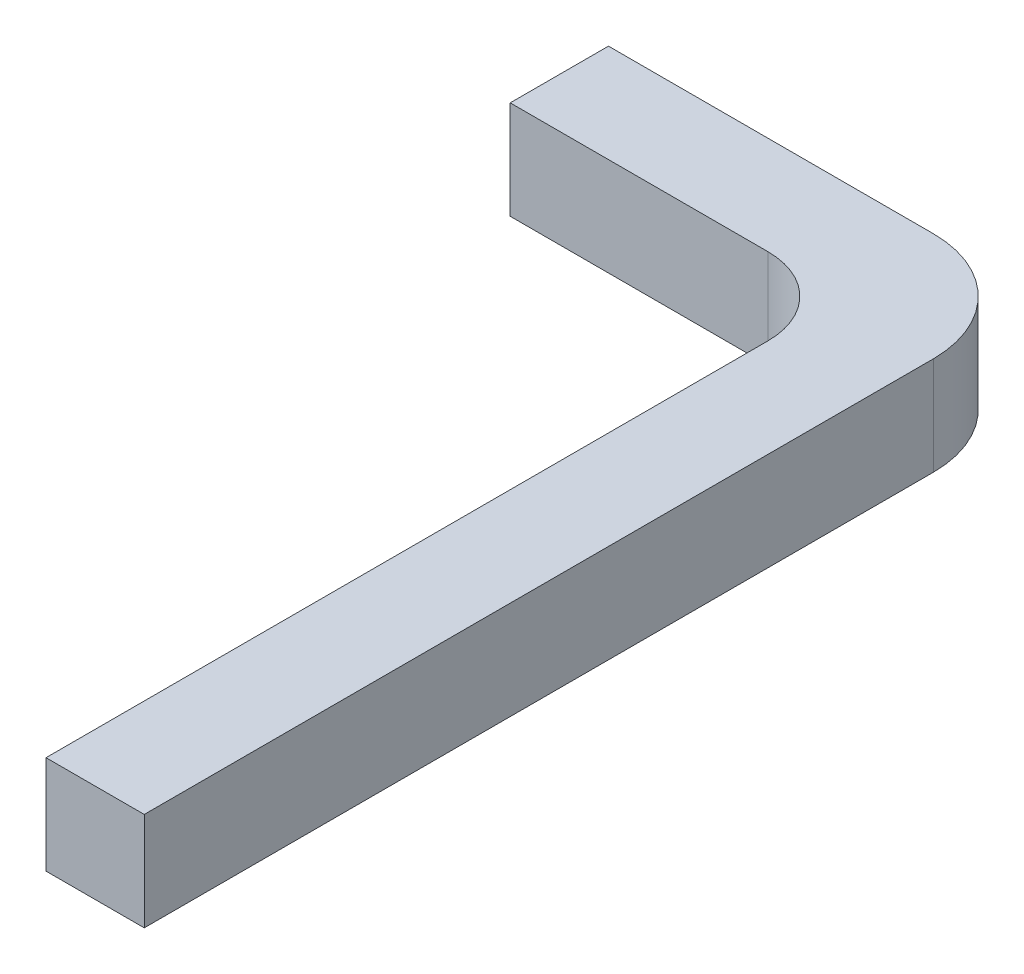
ISO-10303-21;
HEADER;
FILE_DESCRIPTION(('STEP AP214'),'2;1');
FILE_NAME('part.step','',(''),(''),'','','');
FILE_SCHEMA(('AUTOMOTIVE_DESIGN { 1 0 10303 214 1 1 1 1 }'));
ENDSEC;
DATA;
#1=APPLICATION_CONTEXT('core data for automotive mechanical design processes');
#2=APPLICATION_PROTOCOL_DEFINITION('international standard','automotive_design',2000,#1);
#3=PRODUCT_CONTEXT('',#1,'mechanical');
#4=PRODUCT('Part','Part','',(#3));
#5=PRODUCT_RELATED_PRODUCT_CATEGORY('part','',(#4));
#6=PRODUCT_DEFINITION_FORMATION('','',#4);
#7=PRODUCT_DEFINITION_CONTEXT('part definition',#1,'design');
#8=PRODUCT_DEFINITION('design','',#6,#7);
#9=PRODUCT_DEFINITION_SHAPE('','',#8);
#10=(LENGTH_UNIT() NAMED_UNIT(*) SI_UNIT(.MILLI.,.METRE.));
#11=(NAMED_UNIT(*) PLANE_ANGLE_UNIT() SI_UNIT($,.RADIAN.));
#12=(NAMED_UNIT(*) SI_UNIT($,.STERADIAN.) SOLID_ANGLE_UNIT());
#13=UNCERTAINTY_MEASURE_WITH_UNIT(LENGTH_MEASURE(1.E-05),#10,'distance_accuracy_value','');
#14=(GEOMETRIC_REPRESENTATION_CONTEXT(3) GLOBAL_UNCERTAINTY_ASSIGNED_CONTEXT((#13)) GLOBAL_UNIT_ASSIGNED_CONTEXT((#10,
#11,#12)) REPRESENTATION_CONTEXT('',''));
#15=CARTESIAN_POINT('',(0.,0.,0.));
#16=DIRECTION('',(0.,0.,1.));
#17=DIRECTION('',(1.,0.,0.));
#18=AXIS2_PLACEMENT_3D('',#15,#16,#17);
#19=CARTESIAN_POINT('',(0.,6.35,6.35));
#20=DIRECTION('',(0.,0.,-1.));
#21=DIRECTION('',(-1.,0.,0.));
#22=AXIS2_PLACEMENT_3D('',#19,#20,#21);
#23=PLANE('',#22);
#24=DIRECTION('',(1.,0.,0.));
#25=VECTOR('',#24,1.);
#26=CARTESIAN_POINT('',(0.,0.,6.35));
#27=LINE('',#26,#25);
#28=CARTESIAN_POINT('',(0.,0.,6.35));
#29=VERTEX_POINT('',#28);
#30=CARTESIAN_POINT('',(16.65,0.,6.35));
#31=VERTEX_POINT('',#30);
#32=EDGE_CURVE('E149',#29,#31,#27,.T.);
#33=ORIENTED_EDGE('',*,*,#32,.T.);
#34=DIRECTION('',(0.,-1.,0.));
#35=VECTOR('',#34,1.);
#36=CARTESIAN_POINT('',(16.65,6.35,6.35));
#37=LINE('',#36,#35);
#38=CARTESIAN_POINT('',(16.65,6.35,6.35));
#39=VERTEX_POINT('',#38);
#40=EDGE_CURVE('E177',#31,#39,#37,.F.);
#41=ORIENTED_EDGE('',*,*,#40,.T.);
#42=DIRECTION('',(1.,0.,0.));
#43=VECTOR('',#42,1.);
#44=CARTESIAN_POINT('',(0.,6.35,6.35));
#45=LINE('',#44,#43);
#46=CARTESIAN_POINT('',(0.,6.35,6.35));
#47=VERTEX_POINT('',#46);
#48=EDGE_CURVE('E117',#47,#39,#45,.T.);
#49=ORIENTED_EDGE('',*,*,#48,.F.);
#50=DIRECTION('',(0.,-1.,0.));
#51=VECTOR('',#50,1.);
#52=CARTESIAN_POINT('',(0.,6.35,6.35));
#53=LINE('',#52,#51);
#54=EDGE_CURVE('E148',#47,#29,#53,.T.);
#55=ORIENTED_EDGE('',*,*,#54,.T.);
#56=EDGE_LOOP('',(#33,#41,#49,#55));
#57=FACE_BOUND('',#56,.T.);
#58=ADVANCED_FACE('F41',(#57),#23,.F.);
#59=CARTESIAN_POINT('',(21.65,6.35,0.));
#60=DIRECTION('',(1.,0.,0.));
#61=DIRECTION('',(0.,0.,-1.));
#62=AXIS2_PLACEMENT_3D('',#59,#60,#61);
#63=PLANE('',#62);
#64=DIRECTION('',(0.,0.,1.));
#65=VECTOR('',#64,1.);
#66=CARTESIAN_POINT('',(21.65,6.35,0.));
#67=LINE('',#66,#65);
#68=CARTESIAN_POINT('',(21.65,6.35,11.35));
#69=VERTEX_POINT('',#68);
#70=CARTESIAN_POINT('',(21.65,6.35,58.));
#71=VERTEX_POINT('',#70);
#72=EDGE_CURVE('E105',#69,#71,#67,.T.);
#73=ORIENTED_EDGE('',*,*,#72,.F.);
#74=DIRECTION('',(0.,-1.,0.));
#75=VECTOR('',#74,1.);
#76=CARTESIAN_POINT('',(21.65,0.,11.35));
#77=LINE('',#76,#75);
#78=CARTESIAN_POINT('',(21.65,0.,11.35));
#79=VERTEX_POINT('',#78);
#80=EDGE_CURVE('E128',#69,#79,#77,.T.);
#81=ORIENTED_EDGE('',*,*,#80,.T.);
#82=DIRECTION('',(0.,0.,1.));
#83=VECTOR('',#82,1.);
#84=CARTESIAN_POINT('',(21.65,0.,0.));
#85=LINE('',#84,#83);
#86=CARTESIAN_POINT('',(21.65,0.,58.));
#87=VERTEX_POINT('',#86);
#88=EDGE_CURVE('E123',#79,#87,#85,.T.);
#89=ORIENTED_EDGE('',*,*,#88,.T.);
#90=DIRECTION('',(0.,-1.,0.));
#91=VECTOR('',#90,1.);
#92=CARTESIAN_POINT('',(21.65,6.35,58.));
#93=LINE('',#92,#91);
#94=EDGE_CURVE('E120',#71,#87,#93,.T.);
#95=ORIENTED_EDGE('',*,*,#94,.F.);
#96=EDGE_LOOP('',(#73,#81,#89,#95));
#97=FACE_BOUND('',#96,.T.);
#98=ADVANCED_FACE('F121',(#97),#63,.F.);
#99=CARTESIAN_POINT('',(0.,6.35,58.));
#100=DIRECTION('',(0.,0.,1.));
#101=DIRECTION('',(1.,0.,0.));
#102=AXIS2_PLACEMENT_3D('',#99,#100,#101);
#103=PLANE('',#102);
#104=DIRECTION('',(-1.,0.,0.));
#105=VECTOR('',#104,1.);
#106=CARTESIAN_POINT('',(0.,0.,58.));
#107=LINE('',#106,#105);
#108=CARTESIAN_POINT('',(28.,0.,58.));
#109=VERTEX_POINT('',#108);
#110=EDGE_CURVE('E155',#109,#87,#107,.T.);
#111=ORIENTED_EDGE('',*,*,#110,.F.);
#112=DIRECTION('',(0.,-1.,0.));
#113=VECTOR('',#112,1.);
#114=CARTESIAN_POINT('',(28.,6.35,58.));
#115=LINE('',#114,#113);
#116=CARTESIAN_POINT('',(28.,6.35,58.));
#117=VERTEX_POINT('',#116);
#118=EDGE_CURVE('E129',#117,#109,#115,.T.);
#119=ORIENTED_EDGE('',*,*,#118,.F.);
#120=DIRECTION('',(-1.,0.,0.));
#121=VECTOR('',#120,1.);
#122=CARTESIAN_POINT('',(0.,6.35,58.));
#123=LINE('',#122,#121);
#124=EDGE_CURVE('E109',#117,#71,#123,.T.);
#125=ORIENTED_EDGE('',*,*,#124,.T.);
#126=ORIENTED_EDGE('',*,*,#94,.T.);
#127=EDGE_LOOP('',(#111,#119,#125,#126));
#128=FACE_BOUND('',#127,.T.);
#129=ADVANCED_FACE('F132',(#128),#103,.T.);
#130=CARTESIAN_POINT('',(28.,6.35,0.));
#131=DIRECTION('',(1.,0.,0.));
#132=DIRECTION('',(0.,0.,-1.));
#133=AXIS2_PLACEMENT_3D('',#130,#131,#132);
#134=PLANE('',#133);
#135=DIRECTION('',(0.,0.,1.));
#136=VECTOR('',#135,1.);
#137=CARTESIAN_POINT('',(28.,0.,0.));
#138=LINE('',#137,#136);
#139=CARTESIAN_POINT('',(28.,0.,7.));
#140=VERTEX_POINT('',#139);
#141=EDGE_CURVE('E158',#140,#109,#138,.T.);
#142=ORIENTED_EDGE('',*,*,#141,.F.);
#143=DIRECTION('',(0.,-1.,0.));
#144=VECTOR('',#143,1.);
#145=CARTESIAN_POINT('',(28.,6.35,7.));
#146=LINE('',#145,#144);
#147=CARTESIAN_POINT('',(28.,6.35,7.));
#148=VERTEX_POINT('',#147);
#149=EDGE_CURVE('E50',#140,#148,#146,.F.);
#150=ORIENTED_EDGE('',*,*,#149,.T.);
#151=DIRECTION('',(0.,0.,1.));
#152=VECTOR('',#151,1.);
#153=CARTESIAN_POINT('',(28.,6.35,0.));
#154=LINE('',#153,#152);
#155=EDGE_CURVE('E135',#148,#117,#154,.T.);
#156=ORIENTED_EDGE('',*,*,#155,.T.);
#157=ORIENTED_EDGE('',*,*,#118,.T.);
#158=EDGE_LOOP('',(#142,#150,#156,#157));
#159=FACE_BOUND('',#158,.T.);
#160=ADVANCED_FACE('F211',(#159),#134,.T.);
#161=CARTESIAN_POINT('',(0.,6.35,0.));
#162=DIRECTION('',(0.,0.,-1.));
#163=DIRECTION('',(-1.,0.,0.));
#164=AXIS2_PLACEMENT_3D('',#161,#162,#163);
#165=PLANE('',#164);
#166=DIRECTION('',(1.,0.,0.));
#167=VECTOR('',#166,1.);
#168=CARTESIAN_POINT('',(0.,6.35,0.));
#169=LINE('',#168,#167);
#170=CARTESIAN_POINT('',(0.,6.35,0.));
#171=VERTEX_POINT('',#170);
#172=CARTESIAN_POINT('',(21.,6.35,0.));
#173=VERTEX_POINT('',#172);
#174=EDGE_CURVE('E138',#171,#173,#169,.T.);
#175=ORIENTED_EDGE('',*,*,#174,.T.);
#176=DIRECTION('',(0.,-1.,0.));
#177=VECTOR('',#176,1.);
#178=CARTESIAN_POINT('',(21.,6.35,0.));
#179=LINE('',#178,#177);
#180=CARTESIAN_POINT('',(21.,0.,0.));
#181=VERTEX_POINT('',#180);
#182=EDGE_CURVE('E185',#173,#181,#179,.T.);
#183=ORIENTED_EDGE('',*,*,#182,.T.);
#184=DIRECTION('',(1.,0.,0.));
#185=VECTOR('',#184,1.);
#186=CARTESIAN_POINT('',(0.,0.,0.));
#187=LINE('',#186,#185);
#188=CARTESIAN_POINT('',(0.,0.,0.));
#189=VERTEX_POINT('',#188);
#190=EDGE_CURVE('E161',#189,#181,#187,.T.);
#191=ORIENTED_EDGE('',*,*,#190,.F.);
#192=DIRECTION('',(0.,-1.,0.));
#193=VECTOR('',#192,1.);
#194=CARTESIAN_POINT('',(0.,6.35,0.));
#195=LINE('',#194,#193);
#196=EDGE_CURVE('E170',#171,#189,#195,.T.);
#197=ORIENTED_EDGE('',*,*,#196,.F.);
#198=EDGE_LOOP('',(#175,#183,#191,#197));
#199=FACE_BOUND('',#198,.T.);
#200=ADVANCED_FACE('F194',(#199),#165,.T.);
#201=CARTESIAN_POINT('',(0.,6.35,0.));
#202=DIRECTION('',(1.,0.,0.));
#203=DIRECTION('',(0.,0.,-1.));
#204=AXIS2_PLACEMENT_3D('',#201,#202,#203);
#205=PLANE('',#204);
#206=DIRECTION('',(0.,0.,1.));
#207=VECTOR('',#206,1.);
#208=CARTESIAN_POINT('',(0.,0.,0.));
#209=LINE('',#208,#207);
#210=EDGE_CURVE('E164',#189,#29,#209,.T.);
#211=ORIENTED_EDGE('',*,*,#210,.T.);
#212=ORIENTED_EDGE('',*,*,#54,.F.);
#213=DIRECTION('',(0.,0.,1.));
#214=VECTOR('',#213,1.);
#215=CARTESIAN_POINT('',(0.,6.35,0.));
#216=LINE('',#215,#214);
#217=EDGE_CURVE('E145',#171,#47,#216,.T.);
#218=ORIENTED_EDGE('',*,*,#217,.F.);
#219=ORIENTED_EDGE('',*,*,#196,.T.);
#220=EDGE_LOOP('',(#211,#212,#218,#219));
#221=FACE_BOUND('',#220,.T.);
#222=ADVANCED_FACE('F203',(#221),#205,.F.);
#223=CARTESIAN_POINT('',(0.,6.35,0.));
#224=DIRECTION('',(0.,1.,0.));
#225=DIRECTION('',(0.,0.,1.));
#226=AXIS2_PLACEMENT_3D('',#223,#224,#225);
#227=PLANE('',#226);
#228=ORIENTED_EDGE('',*,*,#155,.F.);
#229=CARTESIAN_POINT('',(21.,6.35,7.));
#230=DIRECTION('',(0.,1.,0.));
#231=DIRECTION('',(0.,0.,1.));
#232=AXIS2_PLACEMENT_3D('',#229,#230,#231);
#233=CIRCLE('',#232,7.);
#234=EDGE_CURVE('E11',#148,#173,#233,.T.);
#235=ORIENTED_EDGE('',*,*,#234,.T.);
#236=ORIENTED_EDGE('',*,*,#174,.F.);
#237=ORIENTED_EDGE('',*,*,#217,.T.);
#238=ORIENTED_EDGE('',*,*,#48,.T.);
#239=CARTESIAN_POINT('',(16.65,6.35,11.35));
#240=DIRECTION('',(0.,1.,0.));
#241=DIRECTION('',(0.,0.,1.));
#242=AXIS2_PLACEMENT_3D('',#239,#240,#241);
#243=CIRCLE('',#242,5.);
#244=EDGE_CURVE('E112',#39,#69,#243,.F.);
#245=ORIENTED_EDGE('',*,*,#244,.T.);
#246=ORIENTED_EDGE('',*,*,#72,.T.);
#247=ORIENTED_EDGE('',*,*,#124,.F.);
#248=EDGE_LOOP('',(#228,#235,#236,#237,#238,#245,#246,#247));
#249=FACE_BOUND('',#248,.T.);
#250=ADVANCED_FACE('F107',(#249),#227,.T.);
#251=CARTESIAN_POINT('',(0.,0.,0.));
#252=DIRECTION('',(0.,1.,0.));
#253=DIRECTION('',(0.,0.,1.));
#254=AXIS2_PLACEMENT_3D('',#251,#252,#253);
#255=PLANE('',#254);
#256=ORIENTED_EDGE('',*,*,#190,.T.);
#257=CARTESIAN_POINT('',(21.,0.,7.));
#258=DIRECTION('',(0.,1.,0.));
#259=DIRECTION('',(0.,0.,1.));
#260=AXIS2_PLACEMENT_3D('',#257,#258,#259);
#261=CIRCLE('',#260,7.);
#262=EDGE_CURVE('E64',#181,#140,#261,.F.);
#263=ORIENTED_EDGE('',*,*,#262,.T.);
#264=ORIENTED_EDGE('',*,*,#141,.T.);
#265=ORIENTED_EDGE('',*,*,#110,.T.);
#266=ORIENTED_EDGE('',*,*,#88,.F.);
#267=CARTESIAN_POINT('',(16.65,0.,11.35));
#268=DIRECTION('',(0.,1.,0.));
#269=DIRECTION('',(0.,0.,1.));
#270=AXIS2_PLACEMENT_3D('',#267,#268,#269);
#271=CIRCLE('',#270,5.);
#272=EDGE_CURVE('E180',#79,#31,#271,.T.);
#273=ORIENTED_EDGE('',*,*,#272,.T.);
#274=ORIENTED_EDGE('',*,*,#32,.F.);
#275=ORIENTED_EDGE('',*,*,#210,.F.);
#276=EDGE_LOOP('',(#256,#263,#264,#265,#266,#273,#274,#275));
#277=FACE_BOUND('',#276,.T.);
#278=ADVANCED_FACE('F199',(#277),#255,.F.);
#279=CARTESIAN_POINT('',(16.65,6.35,11.35));
#280=DIRECTION('',(0.,1.,0.));
#281=DIRECTION('',(0.,0.,1.));
#282=AXIS2_PLACEMENT_3D('',#279,#280,#281);
#283=CYLINDRICAL_SURFACE('',#282,5.);
#284=ORIENTED_EDGE('',*,*,#244,.F.);
#285=ORIENTED_EDGE('',*,*,#40,.F.);
#286=ORIENTED_EDGE('',*,*,#272,.F.);
#287=ORIENTED_EDGE('',*,*,#80,.F.);
#288=EDGE_LOOP('',(#284,#285,#286,#287));
#289=FACE_BOUND('',#288,.T.);
#290=ADVANCED_FACE('F210',(#289),#283,.F.);
#291=CARTESIAN_POINT('',(21.,6.35,7.));
#292=DIRECTION('',(0.,-1.,0.));
#293=DIRECTION('',(0.,0.,-1.));
#294=AXIS2_PLACEMENT_3D('',#291,#292,#293);
#295=CYLINDRICAL_SURFACE('',#294,7.);
#296=ORIENTED_EDGE('',*,*,#234,.F.);
#297=ORIENTED_EDGE('',*,*,#149,.F.);
#298=ORIENTED_EDGE('',*,*,#262,.F.);
#299=ORIENTED_EDGE('',*,*,#182,.F.);
#300=EDGE_LOOP('',(#296,#297,#298,#299));
#301=FACE_BOUND('',#300,.T.);
#302=ADVANCED_FACE('F43',(#301),#295,.T.);
#303=CLOSED_SHELL('',(#58,#98,#129,#160,#200,#222,#250,#278,#290,#302));
#304=MANIFOLD_SOLID_BREP('B2',#303);
#305=ADVANCED_BREP_SHAPE_REPRESENTATION('',(#18,#304),#14);
#306=SHAPE_DEFINITION_REPRESENTATION(#9,#305);
ENDSEC;
END-ISO-10303-21;
